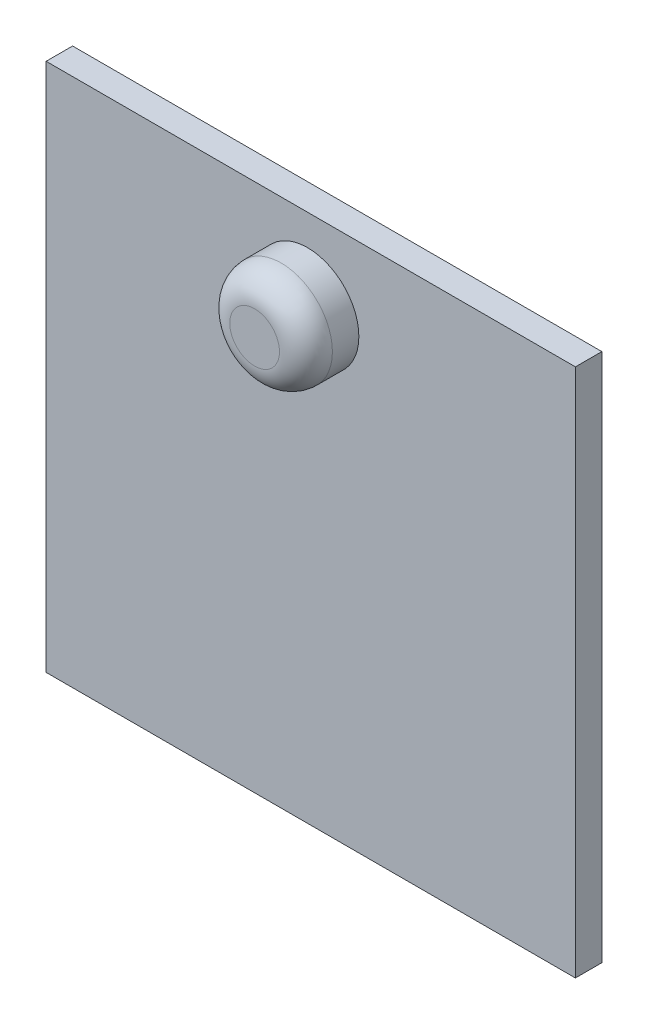
ISO-10303-21;
HEADER;
FILE_DESCRIPTION(('STEP AP214'),'2;1');
FILE_NAME('part.step','',(''),(''),'','','');
FILE_SCHEMA(('AUTOMOTIVE_DESIGN { 1 0 10303 214 1 1 1 1 }'));
ENDSEC;
DATA;
#1=APPLICATION_CONTEXT('core data for automotive mechanical design processes');
#2=APPLICATION_PROTOCOL_DEFINITION('international standard','automotive_design',2000,#1);
#3=PRODUCT_CONTEXT('',#1,'mechanical');
#4=PRODUCT('Part','Part','',(#3));
#5=PRODUCT_RELATED_PRODUCT_CATEGORY('part','',(#4));
#6=PRODUCT_DEFINITION_FORMATION('','',#4);
#7=PRODUCT_DEFINITION_CONTEXT('part definition',#1,'design');
#8=PRODUCT_DEFINITION('design','',#6,#7);
#9=PRODUCT_DEFINITION_SHAPE('','',#8);
#10=(LENGTH_UNIT() NAMED_UNIT(*) SI_UNIT(.MILLI.,.METRE.));
#11=(NAMED_UNIT(*) PLANE_ANGLE_UNIT() SI_UNIT($,.RADIAN.));
#12=(NAMED_UNIT(*) SI_UNIT($,.STERADIAN.) SOLID_ANGLE_UNIT());
#13=UNCERTAINTY_MEASURE_WITH_UNIT(LENGTH_MEASURE(1.E-05),#10,'distance_accuracy_value','');
#14=(GEOMETRIC_REPRESENTATION_CONTEXT(3) GLOBAL_UNCERTAINTY_ASSIGNED_CONTEXT((#13)) GLOBAL_UNIT_ASSIGNED_CONTEXT((#10,
#11,#12)) REPRESENTATION_CONTEXT('',''));
#15=CARTESIAN_POINT('',(0.,0.,0.));
#16=DIRECTION('',(0.,0.,1.));
#17=DIRECTION('',(1.,0.,0.));
#18=AXIS2_PLACEMENT_3D('',#15,#16,#17);
#19=CARTESIAN_POINT('',(-55.46875,136.71875,10.));
#20=DIRECTION('',(1.,0.,0.));
#21=DIRECTION('',(0.,0.,-1.));
#22=AXIS2_PLACEMENT_3D('',#19,#20,#21);
#23=PLANE('',#22);
#24=DIRECTION('',(0.,-1.,0.));
#25=VECTOR('',#24,1.);
#26=CARTESIAN_POINT('',(-55.46875,136.71875,0.));
#27=LINE('',#26,#25);
#28=CARTESIAN_POINT('',(-55.46875,136.71875,0.));
#29=VERTEX_POINT('',#28);
#30=CARTESIAN_POINT('',(-55.46875,-63.28125,0.));
#31=VERTEX_POINT('',#30);
#32=EDGE_CURVE('E118',#29,#31,#27,.T.);
#33=ORIENTED_EDGE('',*,*,#32,.T.);
#34=DIRECTION('',(0.,0.,-1.));
#35=VECTOR('',#34,1.);
#36=CARTESIAN_POINT('',(-55.46875,-63.28125,10.));
#37=LINE('',#36,#35);
#38=CARTESIAN_POINT('',(-55.46875,-63.28125,10.));
#39=VERTEX_POINT('',#38);
#40=EDGE_CURVE('E107',#39,#31,#37,.T.);
#41=ORIENTED_EDGE('',*,*,#40,.F.);
#42=DIRECTION('',(0.,-1.,0.));
#43=VECTOR('',#42,1.);
#44=CARTESIAN_POINT('',(-55.46875,136.71875,10.));
#45=LINE('',#44,#43);
#46=CARTESIAN_POINT('',(-55.46875,136.71875,10.));
#47=VERTEX_POINT('',#46);
#48=EDGE_CURVE('E99',#47,#39,#45,.T.);
#49=ORIENTED_EDGE('',*,*,#48,.F.);
#50=DIRECTION('',(0.,0.,-1.));
#51=VECTOR('',#50,1.);
#52=CARTESIAN_POINT('',(-55.46875,136.71875,10.));
#53=LINE('',#52,#51);
#54=EDGE_CURVE('E114',#47,#29,#53,.T.);
#55=ORIENTED_EDGE('',*,*,#54,.T.);
#56=EDGE_LOOP('',(#33,#41,#49,#55));
#57=FACE_BOUND('',#56,.T.);
#58=ADVANCED_FACE('F45',(#57),#23,.F.);
#59=CARTESIAN_POINT('',(-55.46875,-63.28125,10.));
#60=DIRECTION('',(0.,1.,0.));
#61=DIRECTION('',(0.,0.,1.));
#62=AXIS2_PLACEMENT_3D('',#59,#60,#61);
#63=PLANE('',#62);
#64=DIRECTION('',(1.,0.,0.));
#65=VECTOR('',#64,1.);
#66=CARTESIAN_POINT('',(-55.46875,-63.28125,0.));
#67=LINE('',#66,#65);
#68=CARTESIAN_POINT('',(144.53125,-63.28125,0.));
#69=VERTEX_POINT('',#68);
#70=EDGE_CURVE('E105',#31,#69,#67,.T.);
#71=ORIENTED_EDGE('',*,*,#70,.T.);
#72=DIRECTION('',(0.,0.,-1.));
#73=VECTOR('',#72,1.);
#74=CARTESIAN_POINT('',(144.53125,-63.28125,10.));
#75=LINE('',#74,#73);
#76=CARTESIAN_POINT('',(144.53125,-63.28125,10.));
#77=VERTEX_POINT('',#76);
#78=EDGE_CURVE('E103',#77,#69,#75,.T.);
#79=ORIENTED_EDGE('',*,*,#78,.F.);
#80=DIRECTION('',(1.,0.,0.));
#81=VECTOR('',#80,1.);
#82=CARTESIAN_POINT('',(-55.46875,-63.28125,10.));
#83=LINE('',#82,#81);
#84=EDGE_CURVE('E94',#39,#77,#83,.T.);
#85=ORIENTED_EDGE('',*,*,#84,.F.);
#86=ORIENTED_EDGE('',*,*,#40,.T.);
#87=EDGE_LOOP('',(#71,#79,#85,#86));
#88=FACE_BOUND('',#87,.T.);
#89=ADVANCED_FACE('F104',(#88),#63,.F.);
#90=CARTESIAN_POINT('',(144.53125,136.71875,10.));
#91=DIRECTION('',(-1.,0.,0.));
#92=DIRECTION('',(0.,-1.,0.));
#93=AXIS2_PLACEMENT_3D('',#90,#91,#92);
#94=PLANE('',#93);
#95=DIRECTION('',(0.,1.,0.));
#96=VECTOR('',#95,1.);
#97=CARTESIAN_POINT('',(144.53125,136.71875,0.));
#98=LINE('',#97,#96);
#99=CARTESIAN_POINT('',(144.53125,136.71875,0.));
#100=VERTEX_POINT('',#99);
#101=EDGE_CURVE('E80',#69,#100,#98,.T.);
#102=ORIENTED_EDGE('',*,*,#101,.T.);
#103=DIRECTION('',(0.,0.,-1.));
#104=VECTOR('',#103,1.);
#105=CARTESIAN_POINT('',(144.53125,136.71875,10.));
#106=LINE('',#105,#104);
#107=CARTESIAN_POINT('',(144.53125,136.71875,10.));
#108=VERTEX_POINT('',#107);
#109=EDGE_CURVE('E108',#108,#100,#106,.T.);
#110=ORIENTED_EDGE('',*,*,#109,.F.);
#111=DIRECTION('',(0.,1.,0.));
#112=VECTOR('',#111,1.);
#113=CARTESIAN_POINT('',(144.53125,136.71875,10.));
#114=LINE('',#113,#112);
#115=EDGE_CURVE('E97',#77,#108,#114,.T.);
#116=ORIENTED_EDGE('',*,*,#115,.F.);
#117=ORIENTED_EDGE('',*,*,#78,.T.);
#118=EDGE_LOOP('',(#102,#110,#116,#117));
#119=FACE_BOUND('',#118,.T.);
#120=ADVANCED_FACE('F110',(#119),#94,.F.);
#121=CARTESIAN_POINT('',(-55.46875,136.71875,10.));
#122=DIRECTION('',(0.,-1.,0.));
#123=DIRECTION('',(0.,0.,-1.));
#124=AXIS2_PLACEMENT_3D('',#121,#122,#123);
#125=PLANE('',#124);
#126=DIRECTION('',(-1.,0.,0.));
#127=VECTOR('',#126,1.);
#128=CARTESIAN_POINT('',(-55.46875,136.71875,0.));
#129=LINE('',#128,#127);
#130=EDGE_CURVE('E86',#100,#29,#129,.T.);
#131=ORIENTED_EDGE('',*,*,#130,.T.);
#132=ORIENTED_EDGE('',*,*,#54,.F.);
#133=DIRECTION('',(-1.,0.,0.));
#134=VECTOR('',#133,1.);
#135=CARTESIAN_POINT('',(-55.46875,136.71875,10.));
#136=LINE('',#135,#134);
#137=EDGE_CURVE('E63',#108,#47,#136,.T.);
#138=ORIENTED_EDGE('',*,*,#137,.F.);
#139=ORIENTED_EDGE('',*,*,#109,.T.);
#140=EDGE_LOOP('',(#131,#132,#138,#139));
#141=FACE_BOUND('',#140,.T.);
#142=ADVANCED_FACE('F157',(#141),#125,.F.);
#143=CARTESIAN_POINT('',(0.,0.,10.));
#144=DIRECTION('',(0.,0.,1.));
#145=DIRECTION('',(1.,0.,0.));
#146=AXIS2_PLACEMENT_3D('',#143,#144,#145);
#147=PLANE('',#146);
#148=CARTESIAN_POINT('',(43.3203921059389,105.737649961484,10.));
#149=DIRECTION('',(0.,0.,1.));
#150=DIRECTION('',(1.,0.,0.));
#151=AXIS2_PLACEMENT_3D('',#148,#149,#150);
#152=CIRCLE('',#151,19.3858311023508);
#153=CARTESIAN_POINT('',(62.7062232082897,105.737649961484,10.));
#154=VERTEX_POINT('',#153);
#155=EDGE_CURVE('E122',#154,#154,#152,.T.);
#156=ORIENTED_EDGE('',*,*,#155,.F.);
#157=EDGE_LOOP('',(#156));
#158=FACE_BOUND('',#157,.T.);
#159=ORIENTED_EDGE('',*,*,#48,.T.);
#160=ORIENTED_EDGE('',*,*,#84,.T.);
#161=ORIENTED_EDGE('',*,*,#115,.T.);
#162=ORIENTED_EDGE('',*,*,#137,.T.);
#163=EDGE_LOOP('',(#159,#160,#161,#162));
#164=FACE_BOUND('',#163,.T.);
#165=ADVANCED_FACE('F95',(#158,#164),#147,.T.);
#166=CARTESIAN_POINT('',(0.,0.,0.));
#167=DIRECTION('',(0.,0.,1.));
#168=DIRECTION('',(1.,0.,0.));
#169=AXIS2_PLACEMENT_3D('',#166,#167,#168);
#170=PLANE('',#169);
#171=ORIENTED_EDGE('',*,*,#32,.F.);
#172=ORIENTED_EDGE('',*,*,#130,.F.);
#173=ORIENTED_EDGE('',*,*,#101,.F.);
#174=ORIENTED_EDGE('',*,*,#70,.F.);
#175=EDGE_LOOP('',(#171,#172,#173,#174));
#176=FACE_BOUND('',#175,.T.);
#177=ADVANCED_FACE('F160',(#176),#170,.F.);
#178=CARTESIAN_POINT('',(43.3203921059389,105.737649961484,30.));
#179=DIRECTION('',(0.,0.,-1.));
#180=DIRECTION('',(-1.,0.,0.));
#181=AXIS2_PLACEMENT_3D('',#178,#179,#180);
#182=CYLINDRICAL_SURFACE('',#181,19.3858311023508);
#183=CARTESIAN_POINT('',(43.3203921059389,105.737649961484,20.));
#184=DIRECTION('',(0.,0.,1.));
#185=DIRECTION('',(1.,0.,0.));
#186=AXIS2_PLACEMENT_3D('',#183,#184,#185);
#187=CIRCLE('',#186,19.3858311023508);
#188=CARTESIAN_POINT('',(62.7062232082897,105.737649961484,20.));
#189=VERTEX_POINT('',#188);
#190=EDGE_CURVE('E11',#189,#189,#187,.F.);
#191=ORIENTED_EDGE('',*,*,#190,.T.);
#192=EDGE_LOOP('',(#191));
#193=FACE_BOUND('',#192,.T.);
#194=ORIENTED_EDGE('',*,*,#155,.T.);
#195=EDGE_LOOP('',(#194));
#196=FACE_BOUND('',#195,.T.);
#197=ADVANCED_FACE('F145',(#193,#196),#182,.T.);
#198=CARTESIAN_POINT('',(43.3203921059389,105.737649961484,30.));
#199=DIRECTION('',(0.,0.,1.));
#200=DIRECTION('',(1.,0.,0.));
#201=AXIS2_PLACEMENT_3D('',#198,#199,#200);
#202=PLANE('',#201);
#203=CARTESIAN_POINT('',(43.3203921059389,105.737649961484,30.));
#204=DIRECTION('',(0.,0.,1.));
#205=DIRECTION('',(1.,0.,0.));
#206=AXIS2_PLACEMENT_3D('',#203,#204,#205);
#207=CIRCLE('',#206,9.3858311023508);
#208=CARTESIAN_POINT('',(52.7062232082897,105.737649961484,30.));
#209=VERTEX_POINT('',#208);
#210=EDGE_CURVE('E55',#209,#209,#207,.T.);
#211=ORIENTED_EDGE('',*,*,#210,.T.);
#212=EDGE_LOOP('',(#211));
#213=FACE_BOUND('',#212,.T.);
#214=ADVANCED_FACE('F138',(#213),#202,.T.);
#215=CARTESIAN_POINT('',(43.3203921059389,105.737649961484,20.));
#216=DIRECTION('',(0.,0.,1.));
#217=DIRECTION('',(1.,0.,0.));
#218=AXIS2_PLACEMENT_3D('',#215,#216,#217);
#219=DEGENERATE_TOROIDAL_SURFACE('',#218,9.3858311023508,10.,.T.);
#220=ORIENTED_EDGE('',*,*,#190,.F.);
#221=EDGE_LOOP('',(#220));
#222=FACE_BOUND('',#221,.T.);
#223=ORIENTED_EDGE('',*,*,#210,.F.);
#224=EDGE_LOOP('',(#223));
#225=FACE_BOUND('',#224,.T.);
#226=ADVANCED_FACE('F47',(#222,#225),#219,.T.);
#227=CLOSED_SHELL('',(#58,#89,#120,#142,#165,#177,#197,#214,#226));
#228=MANIFOLD_SOLID_BREP('B2',#227);
#229=ADVANCED_BREP_SHAPE_REPRESENTATION('',(#18,#228),#14);
#230=SHAPE_DEFINITION_REPRESENTATION(#9,#229);
ENDSEC;
END-ISO-10303-21;
